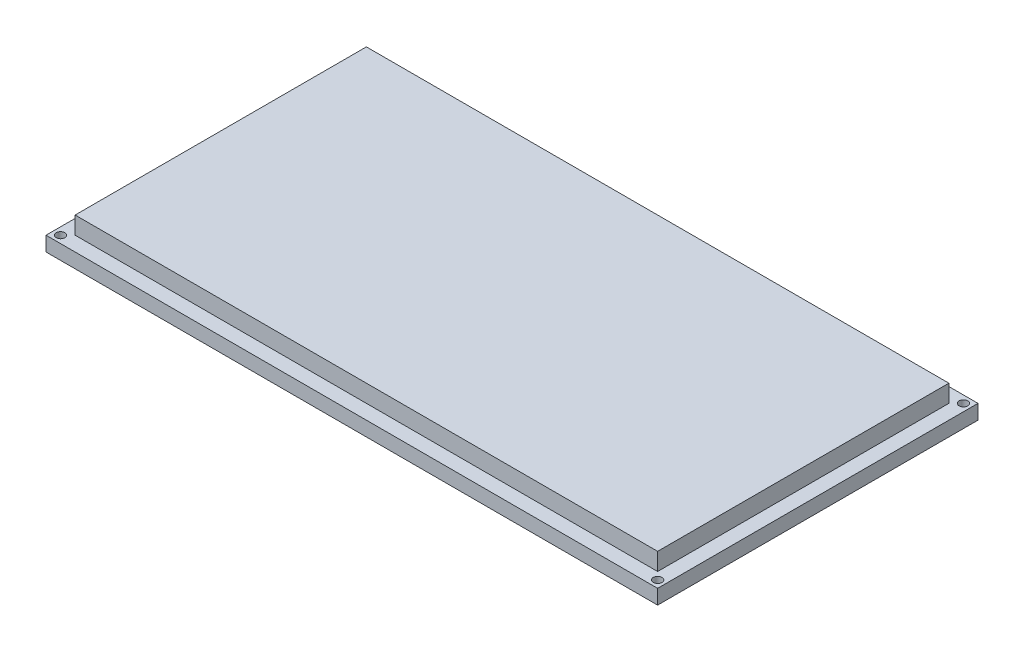
ISO-10303-21;
HEADER;
FILE_DESCRIPTION(('STEP AP214'),'2;1');
FILE_NAME('part.step','',(''),(''),'','','');
FILE_SCHEMA(('AUTOMOTIVE_DESIGN { 1 0 10303 214 1 1 1 1 }'));
ENDSEC;
DATA;
#1=APPLICATION_CONTEXT('core data for automotive mechanical design processes');
#2=APPLICATION_PROTOCOL_DEFINITION('international standard','automotive_design',2000,#1);
#3=PRODUCT_CONTEXT('',#1,'mechanical');
#4=PRODUCT('Part','Part','',(#3));
#5=PRODUCT_RELATED_PRODUCT_CATEGORY('part','',(#4));
#6=PRODUCT_DEFINITION_FORMATION('','',#4);
#7=PRODUCT_DEFINITION_CONTEXT('part definition',#1,'design');
#8=PRODUCT_DEFINITION('design','',#6,#7);
#9=PRODUCT_DEFINITION_SHAPE('','',#8);
#10=(LENGTH_UNIT() NAMED_UNIT(*) SI_UNIT(.MILLI.,.METRE.));
#11=(NAMED_UNIT(*) PLANE_ANGLE_UNIT() SI_UNIT($,.RADIAN.));
#12=(NAMED_UNIT(*) SI_UNIT($,.STERADIAN.) SOLID_ANGLE_UNIT());
#13=UNCERTAINTY_MEASURE_WITH_UNIT(LENGTH_MEASURE(1.E-05),#10,'distance_accuracy_value','');
#14=(GEOMETRIC_REPRESENTATION_CONTEXT(3) GLOBAL_UNCERTAINTY_ASSIGNED_CONTEXT((#13)) GLOBAL_UNIT_ASSIGNED_CONTEXT((#10,
#11,#12)) REPRESENTATION_CONTEXT('',''));
#15=CARTESIAN_POINT('',(0.,0.,0.));
#16=DIRECTION('',(0.,0.,1.));
#17=DIRECTION('',(1.,0.,0.));
#18=AXIS2_PLACEMENT_3D('',#15,#16,#17);
#19=CARTESIAN_POINT('',(-105.,5.,-55.));
#20=DIRECTION('',(1.,0.,0.));
#21=DIRECTION('',(0.,0.,-1.));
#22=AXIS2_PLACEMENT_3D('',#19,#20,#21);
#23=PLANE('',#22);
#24=DIRECTION('',(0.,0.,1.));
#25=VECTOR('',#24,1.);
#26=CARTESIAN_POINT('',(-105.,0.,-55.));
#27=LINE('',#26,#25);
#28=CARTESIAN_POINT('',(-105.,0.,-55.));
#29=VERTEX_POINT('',#28);
#30=CARTESIAN_POINT('',(-105.,0.,55.));
#31=VERTEX_POINT('',#30);
#32=EDGE_CURVE('E131',#29,#31,#27,.T.);
#33=ORIENTED_EDGE('',*,*,#32,.T.);
#34=DIRECTION('',(0.,-1.,0.));
#35=VECTOR('',#34,1.);
#36=CARTESIAN_POINT('',(-105.,5.,55.));
#37=LINE('',#36,#35);
#38=CARTESIAN_POINT('',(-105.,5.,55.));
#39=VERTEX_POINT('',#38);
#40=EDGE_CURVE('E11',#39,#31,#37,.T.);
#41=ORIENTED_EDGE('',*,*,#40,.F.);
#42=DIRECTION('',(0.,0.,1.));
#43=VECTOR('',#42,1.);
#44=CARTESIAN_POINT('',(-105.,5.,-55.));
#45=LINE('',#44,#43);
#46=CARTESIAN_POINT('',(-105.,5.,-55.));
#47=VERTEX_POINT('',#46);
#48=EDGE_CURVE('E142',#47,#39,#45,.T.);
#49=ORIENTED_EDGE('',*,*,#48,.F.);
#50=DIRECTION('',(0.,-1.,0.));
#51=VECTOR('',#50,1.);
#52=CARTESIAN_POINT('',(-105.,5.,-55.));
#53=LINE('',#52,#51);
#54=EDGE_CURVE('E155',#47,#29,#53,.T.);
#55=ORIENTED_EDGE('',*,*,#54,.T.);
#56=EDGE_LOOP('',(#33,#41,#49,#55));
#57=FACE_BOUND('',#56,.T.);
#58=ADVANCED_FACE('F43',(#57),#23,.F.);
#59=CARTESIAN_POINT('',(-105.,5.,55.));
#60=DIRECTION('',(0.,0.,-1.));
#61=DIRECTION('',(-1.,0.,0.));
#62=AXIS2_PLACEMENT_3D('',#59,#60,#61);
#63=PLANE('',#62);
#64=DIRECTION('',(1.,0.,0.));
#65=VECTOR('',#64,1.);
#66=CARTESIAN_POINT('',(-105.,0.,55.));
#67=LINE('',#66,#65);
#68=CARTESIAN_POINT('',(105.,0.,55.));
#69=VERTEX_POINT('',#68);
#70=EDGE_CURVE('E136',#31,#69,#67,.T.);
#71=ORIENTED_EDGE('',*,*,#70,.T.);
#72=DIRECTION('',(0.,-1.,0.));
#73=VECTOR('',#72,1.);
#74=CARTESIAN_POINT('',(105.,5.,55.));
#75=LINE('',#74,#73);
#76=CARTESIAN_POINT('',(105.,5.,55.));
#77=VERTEX_POINT('',#76);
#78=EDGE_CURVE('E51',#77,#69,#75,.T.);
#79=ORIENTED_EDGE('',*,*,#78,.F.);
#80=DIRECTION('',(1.,0.,0.));
#81=VECTOR('',#80,1.);
#82=CARTESIAN_POINT('',(-105.,5.,55.));
#83=LINE('',#82,#81);
#84=EDGE_CURVE('E146',#39,#77,#83,.T.);
#85=ORIENTED_EDGE('',*,*,#84,.F.);
#86=ORIENTED_EDGE('',*,*,#40,.T.);
#87=EDGE_LOOP('',(#71,#79,#85,#86));
#88=FACE_BOUND('',#87,.T.);
#89=ADVANCED_FACE('F192',(#88),#63,.F.);
#90=CARTESIAN_POINT('',(105.,5.,-55.));
#91=DIRECTION('',(-1.,0.,0.));
#92=DIRECTION('',(0.,0.,1.));
#93=AXIS2_PLACEMENT_3D('',#90,#91,#92);
#94=PLANE('',#93);
#95=DIRECTION('',(0.,0.,-1.));
#96=VECTOR('',#95,1.);
#97=CARTESIAN_POINT('',(105.,0.,-55.));
#98=LINE('',#97,#96);
#99=CARTESIAN_POINT('',(105.,0.,-55.));
#100=VERTEX_POINT('',#99);
#101=EDGE_CURVE('E159',#69,#100,#98,.T.);
#102=ORIENTED_EDGE('',*,*,#101,.T.);
#103=DIRECTION('',(0.,-1.,0.));
#104=VECTOR('',#103,1.);
#105=CARTESIAN_POINT('',(105.,5.,-55.));
#106=LINE('',#105,#104);
#107=CARTESIAN_POINT('',(105.,5.,-55.));
#108=VERTEX_POINT('',#107);
#109=EDGE_CURVE('E167',#108,#100,#106,.T.);
#110=ORIENTED_EDGE('',*,*,#109,.F.);
#111=DIRECTION('',(0.,0.,-1.));
#112=VECTOR('',#111,1.);
#113=CARTESIAN_POINT('',(105.,5.,-55.));
#114=LINE('',#113,#112);
#115=EDGE_CURVE('E150',#77,#108,#114,.T.);
#116=ORIENTED_EDGE('',*,*,#115,.F.);
#117=ORIENTED_EDGE('',*,*,#78,.T.);
#118=EDGE_LOOP('',(#102,#110,#116,#117));
#119=FACE_BOUND('',#118,.T.);
#120=ADVANCED_FACE('F176',(#119),#94,.F.);
#121=CARTESIAN_POINT('',(-105.,5.,-55.));
#122=DIRECTION('',(0.,0.,1.));
#123=DIRECTION('',(1.,0.,0.));
#124=AXIS2_PLACEMENT_3D('',#121,#122,#123);
#125=PLANE('',#124);
#126=DIRECTION('',(-1.,0.,0.));
#127=VECTOR('',#126,1.);
#128=CARTESIAN_POINT('',(-105.,0.,-55.));
#129=LINE('',#128,#127);
#130=EDGE_CURVE('E147',#100,#29,#129,.T.);
#131=ORIENTED_EDGE('',*,*,#130,.T.);
#132=ORIENTED_EDGE('',*,*,#54,.F.);
#133=DIRECTION('',(-1.,0.,0.));
#134=VECTOR('',#133,1.);
#135=CARTESIAN_POINT('',(-105.,5.,-55.));
#136=LINE('',#135,#134);
#137=EDGE_CURVE('E153',#108,#47,#136,.T.);
#138=ORIENTED_EDGE('',*,*,#137,.F.);
#139=ORIENTED_EDGE('',*,*,#109,.T.);
#140=EDGE_LOOP('',(#131,#132,#138,#139));
#141=FACE_BOUND('',#140,.T.);
#142=ADVANCED_FACE('F185',(#141),#125,.F.);
#143=CARTESIAN_POINT('',(0.,5.,0.));
#144=DIRECTION('',(0.,1.,0.));
#145=DIRECTION('',(0.,0.,1.));
#146=AXIS2_PLACEMENT_3D('',#143,#144,#145);
#147=PLANE('',#146);
#148=CARTESIAN_POINT('',(102.5,5.,-52.5));
#149=DIRECTION('',(0.,1.,0.));
#150=DIRECTION('',(0.,0.,1.));
#151=AXIS2_PLACEMENT_3D('',#148,#149,#150);
#152=CIRCLE('',#151,1.5);
#153=CARTESIAN_POINT('',(102.5,5.,-51.));
#154=VERTEX_POINT('',#153);
#155=EDGE_CURVE('E242',#154,#154,#152,.T.);
#156=ORIENTED_EDGE('',*,*,#155,.F.);
#157=EDGE_LOOP('',(#156));
#158=FACE_BOUND('',#157,.T.);
#159=CARTESIAN_POINT('',(102.5,5.,52.5));
#160=DIRECTION('',(0.,1.,0.));
#161=DIRECTION('',(0.,0.,1.));
#162=AXIS2_PLACEMENT_3D('',#159,#160,#161);
#163=CIRCLE('',#162,1.5);
#164=CARTESIAN_POINT('',(102.5,5.,54.));
#165=VERTEX_POINT('',#164);
#166=EDGE_CURVE('E247',#165,#165,#163,.T.);
#167=ORIENTED_EDGE('',*,*,#166,.F.);
#168=EDGE_LOOP('',(#167));
#169=FACE_BOUND('',#168,.T.);
#170=CARTESIAN_POINT('',(-102.5,5.,-52.5));
#171=DIRECTION('',(0.,1.,0.));
#172=DIRECTION('',(0.,0.,1.));
#173=AXIS2_PLACEMENT_3D('',#170,#171,#172);
#174=CIRCLE('',#173,1.5);
#175=CARTESIAN_POINT('',(-102.5,5.,-51.));
#176=VERTEX_POINT('',#175);
#177=EDGE_CURVE('E259',#176,#176,#174,.T.);
#178=ORIENTED_EDGE('',*,*,#177,.F.);
#179=EDGE_LOOP('',(#178));
#180=FACE_BOUND('',#179,.T.);
#181=CARTESIAN_POINT('',(-102.5,5.,52.5));
#182=DIRECTION('',(0.,1.,0.));
#183=DIRECTION('',(0.,0.,1.));
#184=AXIS2_PLACEMENT_3D('',#181,#182,#183);
#185=CIRCLE('',#184,1.5);
#186=CARTESIAN_POINT('',(-102.5,5.,54.));
#187=VERTEX_POINT('',#186);
#188=EDGE_CURVE('E267',#187,#187,#185,.T.);
#189=ORIENTED_EDGE('',*,*,#188,.F.);
#190=EDGE_LOOP('',(#189));
#191=FACE_BOUND('',#190,.T.);
#192=DIRECTION('',(0.,0.,1.));
#193=VECTOR('',#192,1.);
#194=CARTESIAN_POINT('',(-100.,5.,50.));
#195=LINE('',#194,#193);
#196=CARTESIAN_POINT('',(-100.,5.,-50.));
#197=VERTEX_POINT('',#196);
#198=CARTESIAN_POINT('',(-100.,5.,50.));
#199=VERTEX_POINT('',#198);
#200=EDGE_CURVE('E58',#197,#199,#195,.T.);
#201=ORIENTED_EDGE('',*,*,#200,.F.);
#202=DIRECTION('',(-1.,0.,0.));
#203=VECTOR('',#202,1.);
#204=CARTESIAN_POINT('',(-100.,5.,-50.));
#205=LINE('',#204,#203);
#206=CARTESIAN_POINT('',(100.,5.,-50.));
#207=VERTEX_POINT('',#206);
#208=EDGE_CURVE('E62',#207,#197,#205,.T.);
#209=ORIENTED_EDGE('',*,*,#208,.F.);
#210=DIRECTION('',(0.,0.,-1.));
#211=VECTOR('',#210,1.);
#212=CARTESIAN_POINT('',(100.,5.,50.));
#213=LINE('',#212,#211);
#214=CARTESIAN_POINT('',(100.,5.,50.));
#215=VERTEX_POINT('',#214);
#216=EDGE_CURVE('E285',#215,#207,#213,.T.);
#217=ORIENTED_EDGE('',*,*,#216,.F.);
#218=DIRECTION('',(1.,0.,0.));
#219=VECTOR('',#218,1.);
#220=CARTESIAN_POINT('',(-100.,5.,50.));
#221=LINE('',#220,#219);
#222=EDGE_CURVE('E282',#199,#215,#221,.T.);
#223=ORIENTED_EDGE('',*,*,#222,.F.);
#224=EDGE_LOOP('',(#201,#209,#217,#223));
#225=FACE_BOUND('',#224,.T.);
#226=ORIENTED_EDGE('',*,*,#48,.T.);
#227=ORIENTED_EDGE('',*,*,#84,.T.);
#228=ORIENTED_EDGE('',*,*,#115,.T.);
#229=ORIENTED_EDGE('',*,*,#137,.T.);
#230=EDGE_LOOP('',(#226,#227,#228,#229));
#231=FACE_BOUND('',#230,.T.);
#232=ADVANCED_FACE('F191',(#158,#169,#180,#191,#225,#231),#147,.T.);
#233=CARTESIAN_POINT('',(0.,0.,0.));
#234=DIRECTION('',(0.,1.,0.));
#235=DIRECTION('',(0.,0.,1.));
#236=AXIS2_PLACEMENT_3D('',#233,#234,#235);
#237=PLANE('',#236);
#238=CARTESIAN_POINT('',(102.5,0.,-52.5));
#239=DIRECTION('',(0.,1.,0.));
#240=DIRECTION('',(0.,0.,1.));
#241=AXIS2_PLACEMENT_3D('',#238,#239,#240);
#242=CIRCLE('',#241,1.5);
#243=CARTESIAN_POINT('',(102.5,0.,-51.));
#244=VERTEX_POINT('',#243);
#245=EDGE_CURVE('E245',#244,#244,#242,.F.);
#246=ORIENTED_EDGE('',*,*,#245,.F.);
#247=EDGE_LOOP('',(#246));
#248=FACE_BOUND('',#247,.T.);
#249=CARTESIAN_POINT('',(102.5,0.,52.5));
#250=DIRECTION('',(0.,1.,0.));
#251=DIRECTION('',(0.,0.,1.));
#252=AXIS2_PLACEMENT_3D('',#249,#250,#251);
#253=CIRCLE('',#252,1.5);
#254=CARTESIAN_POINT('',(102.5,0.,54.));
#255=VERTEX_POINT('',#254);
#256=EDGE_CURVE('E252',#255,#255,#253,.F.);
#257=ORIENTED_EDGE('',*,*,#256,.F.);
#258=EDGE_LOOP('',(#257));
#259=FACE_BOUND('',#258,.T.);
#260=CARTESIAN_POINT('',(-102.5,0.,-52.5));
#261=DIRECTION('',(0.,1.,0.));
#262=DIRECTION('',(0.,0.,1.));
#263=AXIS2_PLACEMENT_3D('',#260,#261,#262);
#264=CIRCLE('',#263,1.5);
#265=CARTESIAN_POINT('',(-102.5,0.,-51.));
#266=VERTEX_POINT('',#265);
#267=EDGE_CURVE('E263',#266,#266,#264,.F.);
#268=ORIENTED_EDGE('',*,*,#267,.F.);
#269=EDGE_LOOP('',(#268));
#270=FACE_BOUND('',#269,.T.);
#271=CARTESIAN_POINT('',(-102.5,0.,52.5));
#272=DIRECTION('',(0.,1.,0.));
#273=DIRECTION('',(0.,0.,1.));
#274=AXIS2_PLACEMENT_3D('',#271,#272,#273);
#275=CIRCLE('',#274,1.5);
#276=CARTESIAN_POINT('',(-102.5,0.,54.));
#277=VERTEX_POINT('',#276);
#278=EDGE_CURVE('E271',#277,#277,#275,.F.);
#279=ORIENTED_EDGE('',*,*,#278,.F.);
#280=EDGE_LOOP('',(#279));
#281=FACE_BOUND('',#280,.T.);
#282=ORIENTED_EDGE('',*,*,#32,.F.);
#283=ORIENTED_EDGE('',*,*,#130,.F.);
#284=ORIENTED_EDGE('',*,*,#101,.F.);
#285=ORIENTED_EDGE('',*,*,#70,.F.);
#286=EDGE_LOOP('',(#282,#283,#284,#285));
#287=FACE_BOUND('',#286,.T.);
#288=ADVANCED_FACE('F182',(#248,#259,#270,#281,#287),#237,.F.);
#289=CARTESIAN_POINT('',(-100.,11.,50.));
#290=DIRECTION('',(1.,0.,0.));
#291=DIRECTION('',(0.,0.,-1.));
#292=AXIS2_PLACEMENT_3D('',#289,#290,#291);
#293=PLANE('',#292);
#294=ORIENTED_EDGE('',*,*,#200,.T.);
#295=DIRECTION('',(0.,-1.,0.));
#296=VECTOR('',#295,1.);
#297=CARTESIAN_POINT('',(-100.,11.,50.));
#298=LINE('',#297,#296);
#299=CARTESIAN_POINT('',(-100.,11.,50.));
#300=VERTEX_POINT('',#299);
#301=EDGE_CURVE('E111',#300,#199,#298,.T.);
#302=ORIENTED_EDGE('',*,*,#301,.F.);
#303=DIRECTION('',(0.,0.,1.));
#304=VECTOR('',#303,1.);
#305=CARTESIAN_POINT('',(-100.,11.,50.));
#306=LINE('',#305,#304);
#307=CARTESIAN_POINT('',(-100.,11.,-50.));
#308=VERTEX_POINT('',#307);
#309=EDGE_CURVE('E118',#308,#300,#306,.T.);
#310=ORIENTED_EDGE('',*,*,#309,.F.);
#311=DIRECTION('',(0.,-1.,0.));
#312=VECTOR('',#311,1.);
#313=CARTESIAN_POINT('',(-100.,11.,-50.));
#314=LINE('',#313,#312);
#315=EDGE_CURVE('E279',#308,#197,#314,.T.);
#316=ORIENTED_EDGE('',*,*,#315,.T.);
#317=EDGE_LOOP('',(#294,#302,#310,#316));
#318=FACE_BOUND('',#317,.T.);
#319=ADVANCED_FACE('F129',(#318),#293,.F.);
#320=CARTESIAN_POINT('',(-100.,11.,50.));
#321=DIRECTION('',(0.,0.,-1.));
#322=DIRECTION('',(-1.,0.,0.));
#323=AXIS2_PLACEMENT_3D('',#320,#321,#322);
#324=PLANE('',#323);
#325=ORIENTED_EDGE('',*,*,#222,.T.);
#326=DIRECTION('',(0.,-1.,0.));
#327=VECTOR('',#326,1.);
#328=CARTESIAN_POINT('',(100.,11.,50.));
#329=LINE('',#328,#327);
#330=CARTESIAN_POINT('',(100.,11.,50.));
#331=VERTEX_POINT('',#330);
#332=EDGE_CURVE('E113',#331,#215,#329,.T.);
#333=ORIENTED_EDGE('',*,*,#332,.F.);
#334=DIRECTION('',(1.,0.,0.));
#335=VECTOR('',#334,1.);
#336=CARTESIAN_POINT('',(-100.,11.,50.));
#337=LINE('',#336,#335);
#338=EDGE_CURVE('E106',#300,#331,#337,.T.);
#339=ORIENTED_EDGE('',*,*,#338,.F.);
#340=ORIENTED_EDGE('',*,*,#301,.T.);
#341=EDGE_LOOP('',(#325,#333,#339,#340));
#342=FACE_BOUND('',#341,.T.);
#343=ADVANCED_FACE('F109',(#342),#324,.F.);
#344=CARTESIAN_POINT('',(100.,11.,50.));
#345=DIRECTION('',(-1.,0.,0.));
#346=DIRECTION('',(0.,0.,1.));
#347=AXIS2_PLACEMENT_3D('',#344,#345,#346);
#348=PLANE('',#347);
#349=ORIENTED_EDGE('',*,*,#216,.T.);
#350=DIRECTION('',(0.,-1.,0.));
#351=VECTOR('',#350,1.);
#352=CARTESIAN_POINT('',(100.,11.,-50.));
#353=LINE('',#352,#351);
#354=CARTESIAN_POINT('',(100.,11.,-50.));
#355=VERTEX_POINT('',#354);
#356=EDGE_CURVE('E138',#355,#207,#353,.T.);
#357=ORIENTED_EDGE('',*,*,#356,.F.);
#358=DIRECTION('',(0.,0.,-1.));
#359=VECTOR('',#358,1.);
#360=CARTESIAN_POINT('',(100.,11.,50.));
#361=LINE('',#360,#359);
#362=EDGE_CURVE('E117',#331,#355,#361,.T.);
#363=ORIENTED_EDGE('',*,*,#362,.F.);
#364=ORIENTED_EDGE('',*,*,#332,.T.);
#365=EDGE_LOOP('',(#349,#357,#363,#364));
#366=FACE_BOUND('',#365,.T.);
#367=ADVANCED_FACE('F212',(#366),#348,.F.);
#368=CARTESIAN_POINT('',(-100.,11.,-50.));
#369=DIRECTION('',(0.,0.,1.));
#370=DIRECTION('',(1.,0.,0.));
#371=AXIS2_PLACEMENT_3D('',#368,#369,#370);
#372=PLANE('',#371);
#373=ORIENTED_EDGE('',*,*,#208,.T.);
#374=ORIENTED_EDGE('',*,*,#315,.F.);
#375=DIRECTION('',(-1.,0.,0.));
#376=VECTOR('',#375,1.);
#377=CARTESIAN_POINT('',(-100.,11.,-50.));
#378=LINE('',#377,#376);
#379=EDGE_CURVE('E123',#355,#308,#378,.T.);
#380=ORIENTED_EDGE('',*,*,#379,.F.);
#381=ORIENTED_EDGE('',*,*,#356,.T.);
#382=EDGE_LOOP('',(#373,#374,#380,#381));
#383=FACE_BOUND('',#382,.T.);
#384=ADVANCED_FACE('F215',(#383),#372,.F.);
#385=CARTESIAN_POINT('',(0.,11.,0.));
#386=DIRECTION('',(0.,-1.,0.));
#387=DIRECTION('',(0.,0.,-1.));
#388=AXIS2_PLACEMENT_3D('',#385,#386,#387);
#389=PLANE('',#388);
#390=ORIENTED_EDGE('',*,*,#309,.T.);
#391=ORIENTED_EDGE('',*,*,#338,.T.);
#392=ORIENTED_EDGE('',*,*,#362,.T.);
#393=ORIENTED_EDGE('',*,*,#379,.T.);
#394=EDGE_LOOP('',(#390,#391,#392,#393));
#395=FACE_BOUND('',#394,.T.);
#396=ADVANCED_FACE('F121',(#395),#389,.F.);
#397=CARTESIAN_POINT('',(-102.5,-0.00100000000000013,52.5));
#398=DIRECTION('',(0.,1.,0.));
#399=DIRECTION('',(0.,0.,1.));
#400=AXIS2_PLACEMENT_3D('',#397,#398,#399);
#401=CYLINDRICAL_SURFACE('',#400,1.5);
#402=ORIENTED_EDGE('',*,*,#188,.T.);
#403=EDGE_LOOP('',(#402));
#404=FACE_BOUND('',#403,.T.);
#405=ORIENTED_EDGE('',*,*,#278,.T.);
#406=EDGE_LOOP('',(#405));
#407=FACE_BOUND('',#406,.T.);
#408=ADVANCED_FACE('F222',(#404,#407),#401,.F.);
#409=CARTESIAN_POINT('',(-102.5,-0.00100000000000013,-52.5));
#410=DIRECTION('',(0.,1.,0.));
#411=DIRECTION('',(0.,0.,1.));
#412=AXIS2_PLACEMENT_3D('',#409,#410,#411);
#413=CYLINDRICAL_SURFACE('',#412,1.5);
#414=ORIENTED_EDGE('',*,*,#177,.T.);
#415=EDGE_LOOP('',(#414));
#416=FACE_BOUND('',#415,.T.);
#417=ORIENTED_EDGE('',*,*,#267,.T.);
#418=EDGE_LOOP('',(#417));
#419=FACE_BOUND('',#418,.T.);
#420=ADVANCED_FACE('F225',(#416,#419),#413,.F.);
#421=CARTESIAN_POINT('',(102.5,-0.00100000000000013,52.5));
#422=DIRECTION('',(0.,1.,0.));
#423=DIRECTION('',(0.,0.,1.));
#424=AXIS2_PLACEMENT_3D('',#421,#422,#423);
#425=CYLINDRICAL_SURFACE('',#424,1.5);
#426=ORIENTED_EDGE('',*,*,#166,.T.);
#427=EDGE_LOOP('',(#426));
#428=FACE_BOUND('',#427,.T.);
#429=ORIENTED_EDGE('',*,*,#256,.T.);
#430=EDGE_LOOP('',(#429));
#431=FACE_BOUND('',#430,.T.);
#432=ADVANCED_FACE('F229',(#428,#431),#425,.F.);
#433=CARTESIAN_POINT('',(102.5,-0.00100000000000013,-52.5));
#434=DIRECTION('',(0.,1.,0.));
#435=DIRECTION('',(0.,0.,1.));
#436=AXIS2_PLACEMENT_3D('',#433,#434,#435);
#437=CYLINDRICAL_SURFACE('',#436,1.5);
#438=ORIENTED_EDGE('',*,*,#155,.T.);
#439=EDGE_LOOP('',(#438));
#440=FACE_BOUND('',#439,.T.);
#441=ORIENTED_EDGE('',*,*,#245,.T.);
#442=EDGE_LOOP('',(#441));
#443=FACE_BOUND('',#442,.T.);
#444=ADVANCED_FACE('F233',(#440,#443),#437,.F.);
#445=CLOSED_SHELL('',(#58,#89,#120,#142,#232,#288,#319,#343,#367,#384,#396,#408,#420,#432,#444));
#446=MANIFOLD_SOLID_BREP('B2',#445);
#447=ADVANCED_BREP_SHAPE_REPRESENTATION('',(#18,#446),#14);
#448=SHAPE_DEFINITION_REPRESENTATION(#9,#447);
ENDSEC;
END-ISO-10303-21;
